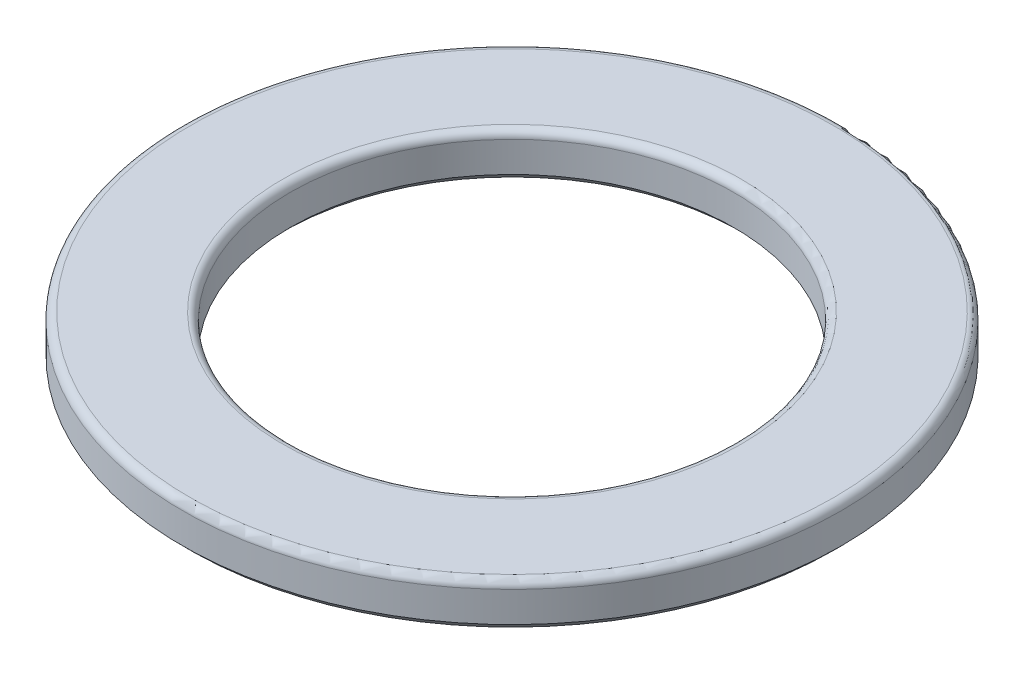
ISO-10303-21;
HEADER;
FILE_DESCRIPTION(('STEP AP214'),'2;1');
FILE_NAME('part.step','',(''),(''),'','','');
FILE_SCHEMA(('AUTOMOTIVE_DESIGN { 1 0 10303 214 1 1 1 1 }'));
ENDSEC;
DATA;
#1=APPLICATION_CONTEXT('core data for automotive mechanical design processes');
#2=APPLICATION_PROTOCOL_DEFINITION('international standard','automotive_design',2000,#1);
#3=PRODUCT_CONTEXT('',#1,'mechanical');
#4=PRODUCT('Part','Part','',(#3));
#5=PRODUCT_RELATED_PRODUCT_CATEGORY('part','',(#4));
#6=PRODUCT_DEFINITION_FORMATION('','',#4);
#7=PRODUCT_DEFINITION_CONTEXT('part definition',#1,'design');
#8=PRODUCT_DEFINITION('design','',#6,#7);
#9=PRODUCT_DEFINITION_SHAPE('','',#8);
#10=(LENGTH_UNIT() NAMED_UNIT(*) SI_UNIT(.MILLI.,.METRE.));
#11=(NAMED_UNIT(*) PLANE_ANGLE_UNIT() SI_UNIT($,.RADIAN.));
#12=(NAMED_UNIT(*) SI_UNIT($,.STERADIAN.) SOLID_ANGLE_UNIT());
#13=UNCERTAINTY_MEASURE_WITH_UNIT(LENGTH_MEASURE(1.E-05),#10,'distance_accuracy_value','');
#14=(GEOMETRIC_REPRESENTATION_CONTEXT(3) GLOBAL_UNCERTAINTY_ASSIGNED_CONTEXT((#13)) GLOBAL_UNIT_ASSIGNED_CONTEXT((#10,
#11,#12)) REPRESENTATION_CONTEXT('',''));
#15=CARTESIAN_POINT('',(0.,0.,0.));
#16=DIRECTION('',(0.,0.,1.));
#17=DIRECTION('',(1.,0.,0.));
#18=AXIS2_PLACEMENT_3D('',#15,#16,#17);
#19=CARTESIAN_POINT('',(21.75,12.,0.));
#20=DIRECTION('',(0.,1.,0.));
#21=DIRECTION('',(-1.,0.,0.));
#22=AXIS2_PLACEMENT_3D('',#19,#20,#21);
#23=PLANE('',#22);
#24=CARTESIAN_POINT('',(0.,12.,0.));
#25=DIRECTION('',(0.,-1.,0.));
#26=DIRECTION('',(1.,0.,0.));
#27=AXIS2_PLACEMENT_3D('',#24,#25,#26);
#28=CIRCLE('',#27,18.1);
#29=CARTESIAN_POINT('',(18.1,12.,0.));
#30=VERTEX_POINT('',#29);
#31=EDGE_CURVE('E11',#30,#30,#28,.T.);
#32=ORIENTED_EDGE('',*,*,#31,.T.);
#33=EDGE_LOOP('',(#32));
#34=FACE_BOUND('',#33,.T.);
#35=CARTESIAN_POINT('',(0.,12.,0.));
#36=DIRECTION('',(0.,-1.,0.));
#37=DIRECTION('',(1.,0.,0.));
#38=AXIS2_PLACEMENT_3D('',#35,#36,#37);
#39=CIRCLE('',#38,25.4);
#40=CARTESIAN_POINT('',(25.4,12.,0.));
#41=VERTEX_POINT('',#40);
#42=EDGE_CURVE('E63',#41,#41,#39,.T.);
#43=ORIENTED_EDGE('',*,*,#42,.F.);
#44=EDGE_LOOP('',(#43));
#45=FACE_BOUND('',#44,.T.);
#46=ADVANCED_FACE('F16',(#34,#45),#23,.T.);
#47=CARTESIAN_POINT('',(0.,11.4,0.));
#48=DIRECTION('',(0.,-1.,0.));
#49=DIRECTION('',(0.,0.,-1.));
#50=AXIS2_PLACEMENT_3D('',#47,#48,#49);
#51=TOROIDAL_SURFACE('',#50,18.1,0.6);
#52=CARTESIAN_POINT('',(0.,11.4,0.));
#53=DIRECTION('',(0.,-1.,0.));
#54=DIRECTION('',(1.,0.,0.));
#55=AXIS2_PLACEMENT_3D('',#52,#53,#54);
#56=CIRCLE('',#55,17.5);
#57=CARTESIAN_POINT('',(17.5,11.4,0.));
#58=VERTEX_POINT('',#57);
#59=EDGE_CURVE('E20',#58,#58,#56,.T.);
#60=ORIENTED_EDGE('',*,*,#59,.T.);
#61=EDGE_LOOP('',(#60));
#62=FACE_BOUND('',#61,.T.);
#63=ORIENTED_EDGE('',*,*,#31,.F.);
#64=EDGE_LOOP('',(#63));
#65=FACE_BOUND('',#64,.T.);
#66=ADVANCED_FACE('F18',(#62,#65),#51,.T.);
#67=CARTESIAN_POINT('',(0.,10.2,0.));
#68=DIRECTION('',(0.,1.,0.));
#69=DIRECTION('',(1.,0.,0.));
#70=AXIS2_PLACEMENT_3D('',#67,#68,#69);
#71=CYLINDRICAL_SURFACE('',#70,17.5);
#72=CARTESIAN_POINT('',(0.,9.,0.));
#73=DIRECTION('',(0.,-1.,0.));
#74=DIRECTION('',(1.,0.,0.));
#75=AXIS2_PLACEMENT_3D('',#72,#73,#74);
#76=CIRCLE('',#75,17.5);
#77=CARTESIAN_POINT('',(17.5,9.,0.));
#78=VERTEX_POINT('',#77);
#79=EDGE_CURVE('E57',#78,#78,#76,.T.);
#80=ORIENTED_EDGE('',*,*,#79,.T.);
#81=EDGE_LOOP('',(#80));
#82=FACE_BOUND('',#81,.T.);
#83=ORIENTED_EDGE('',*,*,#59,.F.);
#84=EDGE_LOOP('',(#83));
#85=FACE_BOUND('',#84,.T.);
#86=ADVANCED_FACE('F103',(#82,#85),#71,.F.);
#87=CARTESIAN_POINT('',(0.,8.7,0.));
#88=DIRECTION('',(0.,-1.,0.));
#89=DIRECTION('',(1.,0.,0.));
#90=AXIS2_PLACEMENT_3D('',#87,#88,#89);
#91=CONICAL_SURFACE('',#90,17.8,0.785398163397449);
#92=CARTESIAN_POINT('',(0.,8.4,0.));
#93=DIRECTION('',(0.,-1.,0.));
#94=DIRECTION('',(1.,0.,0.));
#95=AXIS2_PLACEMENT_3D('',#92,#93,#94);
#96=CIRCLE('',#95,18.1);
#97=CARTESIAN_POINT('',(18.1,8.4,0.));
#98=VERTEX_POINT('',#97);
#99=EDGE_CURVE('E53',#98,#98,#96,.T.);
#100=ORIENTED_EDGE('',*,*,#99,.T.);
#101=EDGE_LOOP('',(#100));
#102=FACE_BOUND('',#101,.T.);
#103=ORIENTED_EDGE('',*,*,#79,.F.);
#104=EDGE_LOOP('',(#103));
#105=FACE_BOUND('',#104,.T.);
#106=ADVANCED_FACE('F54',(#102,#105),#91,.F.);
#107=CARTESIAN_POINT('',(19.15,8.4,0.));
#108=DIRECTION('',(0.,-1.,0.));
#109=DIRECTION('',(1.,0.,0.));
#110=AXIS2_PLACEMENT_3D('',#107,#108,#109);
#111=PLANE('',#110);
#112=CARTESIAN_POINT('',(0.,8.4,0.));
#113=DIRECTION('',(0.,-1.,0.));
#114=DIRECTION('',(1.,0.,0.));
#115=AXIS2_PLACEMENT_3D('',#112,#113,#114);
#116=CIRCLE('',#115,20.2);
#117=CARTESIAN_POINT('',(20.2,8.4,0.));
#118=VERTEX_POINT('',#117);
#119=EDGE_CURVE('E58',#118,#118,#116,.T.);
#120=ORIENTED_EDGE('',*,*,#119,.T.);
#121=EDGE_LOOP('',(#120));
#122=FACE_BOUND('',#121,.T.);
#123=ORIENTED_EDGE('',*,*,#99,.F.);
#124=EDGE_LOOP('',(#123));
#125=FACE_BOUND('',#124,.T.);
#126=ADVANCED_FACE('F110',(#122,#125),#111,.T.);
#127=CARTESIAN_POINT('',(0.,6.,0.));
#128=DIRECTION('',(0.,-1.,0.));
#129=DIRECTION('',(0.,0.,-1.));
#130=AXIS2_PLACEMENT_3D('',#127,#128,#129);
#131=TOROIDAL_SURFACE('',#130,22.,3.);
#132=CARTESIAN_POINT('',(0.,8.4,0.));
#133=DIRECTION('',(0.,-1.,0.));
#134=DIRECTION('',(1.,0.,0.));
#135=AXIS2_PLACEMENT_3D('',#132,#133,#134);
#136=CIRCLE('',#135,23.8);
#137=CARTESIAN_POINT('',(23.8,8.4,0.));
#138=VERTEX_POINT('',#137);
#139=EDGE_CURVE('E61',#138,#138,#136,.T.);
#140=ORIENTED_EDGE('',*,*,#139,.T.);
#141=EDGE_LOOP('',(#140));
#142=FACE_BOUND('',#141,.T.);
#143=ORIENTED_EDGE('',*,*,#119,.F.);
#144=EDGE_LOOP('',(#143));
#145=FACE_BOUND('',#144,.T.);
#146=ADVANCED_FACE('F95',(#142,#145),#131,.F.);
#147=CARTESIAN_POINT('',(24.6,8.4,0.));
#148=DIRECTION('',(0.,-1.,0.));
#149=DIRECTION('',(1.,0.,0.));
#150=AXIS2_PLACEMENT_3D('',#147,#148,#149);
#151=PLANE('',#150);
#152=CARTESIAN_POINT('',(0.,8.4,0.));
#153=DIRECTION('',(0.,-1.,0.));
#154=DIRECTION('',(1.,0.,0.));
#155=AXIS2_PLACEMENT_3D('',#152,#153,#154);
#156=CIRCLE('',#155,25.4);
#157=CARTESIAN_POINT('',(25.4,8.4,0.));
#158=VERTEX_POINT('',#157);
#159=EDGE_CURVE('E69',#158,#158,#156,.T.);
#160=ORIENTED_EDGE('',*,*,#159,.T.);
#161=EDGE_LOOP('',(#160));
#162=FACE_BOUND('',#161,.T.);
#163=ORIENTED_EDGE('',*,*,#139,.F.);
#164=EDGE_LOOP('',(#163));
#165=FACE_BOUND('',#164,.T.);
#166=ADVANCED_FACE('F80',(#162,#165),#151,.T.);
#167=CARTESIAN_POINT('',(0.,8.7,0.));
#168=DIRECTION('',(0.,1.,0.));
#169=DIRECTION('',(1.,0.,0.));
#170=AXIS2_PLACEMENT_3D('',#167,#168,#169);
#171=CONICAL_SURFACE('',#170,25.7,0.785398163397447);
#172=CARTESIAN_POINT('',(0.,9.,0.));
#173=DIRECTION('',(0.,-1.,0.));
#174=DIRECTION('',(1.,0.,0.));
#175=AXIS2_PLACEMENT_3D('',#172,#173,#174);
#176=CIRCLE('',#175,26.);
#177=CARTESIAN_POINT('',(26.,9.,0.));
#178=VERTEX_POINT('',#177);
#179=EDGE_CURVE('E65',#178,#178,#176,.T.);
#180=ORIENTED_EDGE('',*,*,#179,.T.);
#181=EDGE_LOOP('',(#180));
#182=FACE_BOUND('',#181,.T.);
#183=ORIENTED_EDGE('',*,*,#159,.F.);
#184=EDGE_LOOP('',(#183));
#185=FACE_BOUND('',#184,.T.);
#186=ADVANCED_FACE('F83',(#182,#185),#171,.T.);
#187=CARTESIAN_POINT('',(0.,10.2,0.));
#188=DIRECTION('',(0.,1.,0.));
#189=DIRECTION('',(1.,0.,0.));
#190=AXIS2_PLACEMENT_3D('',#187,#188,#189);
#191=CYLINDRICAL_SURFACE('',#190,26.);
#192=CARTESIAN_POINT('',(0.,11.4,0.));
#193=DIRECTION('',(0.,-1.,0.));
#194=DIRECTION('',(1.,0.,0.));
#195=AXIS2_PLACEMENT_3D('',#192,#193,#194);
#196=CIRCLE('',#195,26.);
#197=CARTESIAN_POINT('',(26.,11.4,0.));
#198=VERTEX_POINT('',#197);
#199=EDGE_CURVE('E66',#198,#198,#196,.T.);
#200=ORIENTED_EDGE('',*,*,#199,.T.);
#201=EDGE_LOOP('',(#200));
#202=FACE_BOUND('',#201,.T.);
#203=ORIENTED_EDGE('',*,*,#179,.F.);
#204=EDGE_LOOP('',(#203));
#205=FACE_BOUND('',#204,.T.);
#206=ADVANCED_FACE('F85',(#202,#205),#191,.T.);
#207=CARTESIAN_POINT('',(0.,11.4,0.));
#208=DIRECTION('',(0.,-1.,0.));
#209=DIRECTION('',(0.,0.,-1.));
#210=AXIS2_PLACEMENT_3D('',#207,#208,#209);
#211=TOROIDAL_SURFACE('',#210,25.4,0.6);
#212=ORIENTED_EDGE('',*,*,#42,.T.);
#213=EDGE_LOOP('',(#212));
#214=FACE_BOUND('',#213,.T.);
#215=ORIENTED_EDGE('',*,*,#199,.F.);
#216=EDGE_LOOP('',(#215));
#217=FACE_BOUND('',#216,.T.);
#218=ADVANCED_FACE('F93',(#214,#217),#211,.T.);
#219=CLOSED_SHELL('',(#46,#66,#86,#106,#126,#146,#166,#186,#206,#218));
#220=MANIFOLD_SOLID_BREP('B1',#219);
#221=ADVANCED_BREP_SHAPE_REPRESENTATION('',(#18,#220),#14);
#222=SHAPE_DEFINITION_REPRESENTATION(#9,#221);
ENDSEC;
END-ISO-10303-21;
